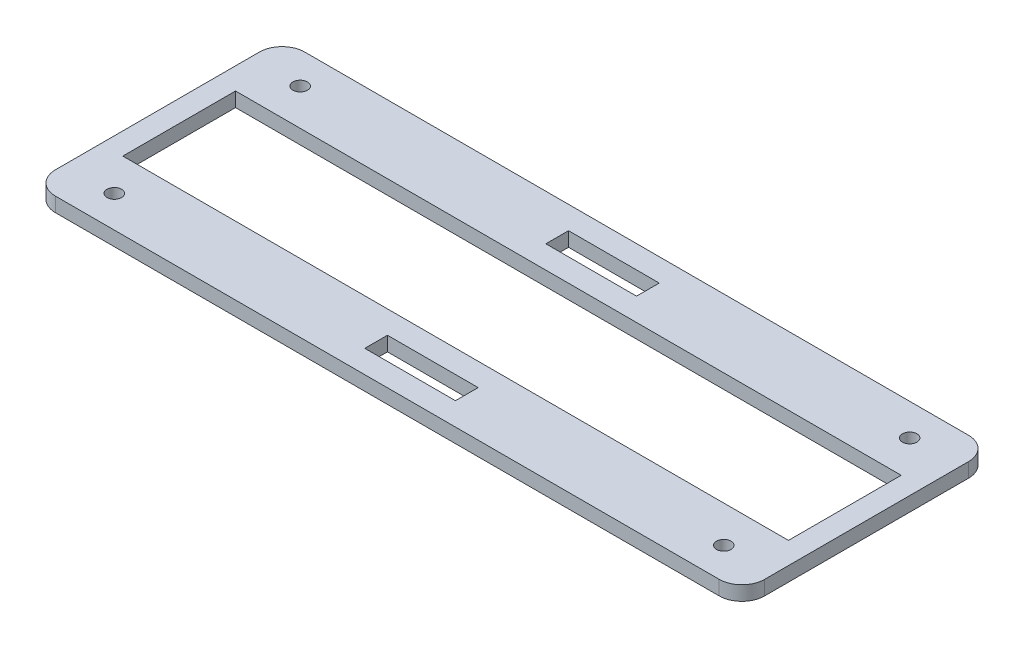
ISO-10303-21;
HEADER;
FILE_DESCRIPTION(('STEP AP214'),'2;1');
FILE_NAME('part.step','',(''),(''),'','','');
FILE_SCHEMA(('AUTOMOTIVE_DESIGN { 1 0 10303 214 1 1 1 1 }'));
ENDSEC;
DATA;
#1=APPLICATION_CONTEXT('core data for automotive mechanical design processes');
#2=APPLICATION_PROTOCOL_DEFINITION('international standard','automotive_design',2000,#1);
#3=PRODUCT_CONTEXT('',#1,'mechanical');
#4=PRODUCT('Part','Part','',(#3));
#5=PRODUCT_RELATED_PRODUCT_CATEGORY('part','',(#4));
#6=PRODUCT_DEFINITION_FORMATION('','',#4);
#7=PRODUCT_DEFINITION_CONTEXT('part definition',#1,'design');
#8=PRODUCT_DEFINITION('design','',#6,#7);
#9=PRODUCT_DEFINITION_SHAPE('','',#8);
#10=(LENGTH_UNIT() NAMED_UNIT(*) SI_UNIT(.MILLI.,.METRE.));
#11=(NAMED_UNIT(*) PLANE_ANGLE_UNIT() SI_UNIT($,.RADIAN.));
#12=(NAMED_UNIT(*) SI_UNIT($,.STERADIAN.) SOLID_ANGLE_UNIT());
#13=UNCERTAINTY_MEASURE_WITH_UNIT(LENGTH_MEASURE(1.E-05),#10,'distance_accuracy_value','');
#14=(GEOMETRIC_REPRESENTATION_CONTEXT(3) GLOBAL_UNCERTAINTY_ASSIGNED_CONTEXT((#13)) GLOBAL_UNIT_ASSIGNED_CONTEXT((#10,
#11,#12)) REPRESENTATION_CONTEXT('',''));
#15=CARTESIAN_POINT('',(0.,0.,0.));
#16=DIRECTION('',(0.,0.,1.));
#17=DIRECTION('',(1.,0.,0.));
#18=AXIS2_PLACEMENT_3D('',#15,#16,#17);
#19=CARTESIAN_POINT('',(78.2,3.175,-27.5));
#20=DIRECTION('',(-1.,0.,0.));
#21=DIRECTION('',(0.,0.,1.));
#22=AXIS2_PLACEMENT_3D('',#19,#20,#21);
#23=PLANE('',#22);
#24=DIRECTION('',(0.,0.,-1.));
#25=VECTOR('',#24,1.);
#26=CARTESIAN_POINT('',(78.2,0.,-27.5));
#27=LINE('',#26,#25);
#28=CARTESIAN_POINT('',(78.2,0.,22.5));
#29=VERTEX_POINT('',#28);
#30=CARTESIAN_POINT('',(78.2,0.,-22.5));
#31=VERTEX_POINT('',#30);
#32=EDGE_CURVE('E301',#29,#31,#27,.T.);
#33=ORIENTED_EDGE('',*,*,#32,.T.);
#34=DIRECTION('',(0.,-1.,0.));
#35=VECTOR('',#34,1.);
#36=CARTESIAN_POINT('',(78.2,3.175,-22.5));
#37=LINE('',#36,#35);
#38=CARTESIAN_POINT('',(78.2,3.175,-22.5));
#39=VERTEX_POINT('',#38);
#40=EDGE_CURVE('E340',#31,#39,#37,.F.);
#41=ORIENTED_EDGE('',*,*,#40,.T.);
#42=DIRECTION('',(0.,0.,-1.));
#43=VECTOR('',#42,1.);
#44=CARTESIAN_POINT('',(78.2,3.175,-27.5));
#45=LINE('',#44,#43);
#46=CARTESIAN_POINT('',(78.2,3.175,22.5));
#47=VERTEX_POINT('',#46);
#48=EDGE_CURVE('E304',#47,#39,#45,.T.);
#49=ORIENTED_EDGE('',*,*,#48,.F.);
#50=DIRECTION('',(0.,-1.,0.));
#51=VECTOR('',#50,1.);
#52=CARTESIAN_POINT('',(78.2,3.175,22.5));
#53=LINE('',#52,#51);
#54=EDGE_CURVE('E337',#47,#29,#53,.T.);
#55=ORIENTED_EDGE('',*,*,#54,.T.);
#56=EDGE_LOOP('',(#33,#41,#49,#55));
#57=FACE_BOUND('',#56,.T.);
#58=ADVANCED_FACE('F33',(#57),#23,.F.);
#59=CARTESIAN_POINT('',(-78.2,3.175,-27.5));
#60=DIRECTION('',(0.,0.,1.));
#61=DIRECTION('',(1.,0.,0.));
#62=AXIS2_PLACEMENT_3D('',#59,#60,#61);
#63=PLANE('',#62);
#64=DIRECTION('',(-1.,0.,0.));
#65=VECTOR('',#64,1.);
#66=CARTESIAN_POINT('',(-78.2,3.175,-27.5));
#67=LINE('',#66,#65);
#68=CARTESIAN_POINT('',(73.2,3.175,-27.5));
#69=VERTEX_POINT('',#68);
#70=CARTESIAN_POINT('',(-73.2,3.175,-27.5));
#71=VERTEX_POINT('',#70);
#72=EDGE_CURVE('E307',#69,#71,#67,.T.);
#73=ORIENTED_EDGE('',*,*,#72,.F.);
#74=DIRECTION('',(0.,-1.,0.));
#75=VECTOR('',#74,1.);
#76=CARTESIAN_POINT('',(73.2,3.175,-27.5));
#77=LINE('',#76,#75);
#78=CARTESIAN_POINT('',(73.2,0.,-27.5));
#79=VERTEX_POINT('',#78);
#80=EDGE_CURVE('E326',#69,#79,#77,.T.);
#81=ORIENTED_EDGE('',*,*,#80,.T.);
#82=DIRECTION('',(-1.,0.,0.));
#83=VECTOR('',#82,1.);
#84=CARTESIAN_POINT('',(-78.2,0.,-27.5));
#85=LINE('',#84,#83);
#86=CARTESIAN_POINT('',(-73.2,0.,-27.5));
#87=VERTEX_POINT('',#86);
#88=EDGE_CURVE('E318',#79,#87,#85,.T.);
#89=ORIENTED_EDGE('',*,*,#88,.T.);
#90=DIRECTION('',(0.,-1.,0.));
#91=VECTOR('',#90,1.);
#92=CARTESIAN_POINT('',(-73.2,3.175,-27.5));
#93=LINE('',#92,#91);
#94=EDGE_CURVE('E315',#87,#71,#93,.F.);
#95=ORIENTED_EDGE('',*,*,#94,.T.);
#96=EDGE_LOOP('',(#73,#81,#89,#95));
#97=FACE_BOUND('',#96,.T.);
#98=ADVANCED_FACE('F380',(#97),#63,.F.);
#99=CARTESIAN_POINT('',(-78.2,3.175,-27.5));
#100=DIRECTION('',(1.,0.,0.));
#101=DIRECTION('',(0.,0.,-1.));
#102=AXIS2_PLACEMENT_3D('',#99,#100,#101);
#103=PLANE('',#102);
#104=DIRECTION('',(0.,0.,1.));
#105=VECTOR('',#104,1.);
#106=CARTESIAN_POINT('',(-78.2,3.175,-27.5));
#107=LINE('',#106,#105);
#108=CARTESIAN_POINT('',(-78.2,3.175,-22.5));
#109=VERTEX_POINT('',#108);
#110=CARTESIAN_POINT('',(-78.2,3.175,22.5));
#111=VERTEX_POINT('',#110);
#112=EDGE_CURVE('E311',#109,#111,#107,.T.);
#113=ORIENTED_EDGE('',*,*,#112,.F.);
#114=DIRECTION('',(0.,-1.,0.));
#115=VECTOR('',#114,1.);
#116=CARTESIAN_POINT('',(-78.2,3.175,-22.5));
#117=LINE('',#116,#115);
#118=CARTESIAN_POINT('',(-78.2,0.,-22.5));
#119=VERTEX_POINT('',#118);
#120=EDGE_CURVE('E11',#109,#119,#117,.T.);
#121=ORIENTED_EDGE('',*,*,#120,.T.);
#122=DIRECTION('',(0.,0.,1.));
#123=VECTOR('',#122,1.);
#124=CARTESIAN_POINT('',(-78.2,0.,-27.5));
#125=LINE('',#124,#123);
#126=CARTESIAN_POINT('',(-78.2,0.,22.5));
#127=VERTEX_POINT('',#126);
#128=EDGE_CURVE('E321',#119,#127,#125,.T.);
#129=ORIENTED_EDGE('',*,*,#128,.T.);
#130=DIRECTION('',(0.,-1.,0.));
#131=VECTOR('',#130,1.);
#132=CARTESIAN_POINT('',(-78.2,3.175,22.5));
#133=LINE('',#132,#131);
#134=EDGE_CURVE('E41',#127,#111,#133,.F.);
#135=ORIENTED_EDGE('',*,*,#134,.T.);
#136=EDGE_LOOP('',(#113,#121,#129,#135));
#137=FACE_BOUND('',#136,.T.);
#138=ADVANCED_FACE('F355',(#137),#103,.F.);
#139=CARTESIAN_POINT('',(-78.2,3.175,27.5));
#140=DIRECTION('',(0.,0.,-1.));
#141=DIRECTION('',(-1.,0.,0.));
#142=AXIS2_PLACEMENT_3D('',#139,#140,#141);
#143=PLANE('',#142);
#144=DIRECTION('',(1.,0.,0.));
#145=VECTOR('',#144,1.);
#146=CARTESIAN_POINT('',(-78.2,0.,27.5));
#147=LINE('',#146,#145);
#148=CARTESIAN_POINT('',(-73.2,0.,27.5));
#149=VERTEX_POINT('',#148);
#150=CARTESIAN_POINT('',(73.2,0.,27.5));
#151=VERTEX_POINT('',#150);
#152=EDGE_CURVE('E308',#149,#151,#147,.T.);
#153=ORIENTED_EDGE('',*,*,#152,.T.);
#154=DIRECTION('',(0.,-1.,0.));
#155=VECTOR('',#154,1.);
#156=CARTESIAN_POINT('',(73.2,3.175,27.5));
#157=LINE('',#156,#155);
#158=CARTESIAN_POINT('',(73.2,3.175,27.5));
#159=VERTEX_POINT('',#158);
#160=EDGE_CURVE('E48',#151,#159,#157,.F.);
#161=ORIENTED_EDGE('',*,*,#160,.T.);
#162=DIRECTION('',(1.,0.,0.));
#163=VECTOR('',#162,1.);
#164=CARTESIAN_POINT('',(-78.2,3.175,27.5));
#165=LINE('',#164,#163);
#166=CARTESIAN_POINT('',(-73.2,3.175,27.5));
#167=VERTEX_POINT('',#166);
#168=EDGE_CURVE('E313',#167,#159,#165,.T.);
#169=ORIENTED_EDGE('',*,*,#168,.F.);
#170=DIRECTION('',(0.,-1.,0.));
#171=VECTOR('',#170,1.);
#172=CARTESIAN_POINT('',(-73.2,3.175,27.5));
#173=LINE('',#172,#171);
#174=EDGE_CURVE('E349',#167,#149,#173,.T.);
#175=ORIENTED_EDGE('',*,*,#174,.T.);
#176=EDGE_LOOP('',(#153,#161,#169,#175));
#177=FACE_BOUND('',#176,.T.);
#178=ADVANCED_FACE('F362',(#177),#143,.F.);
#179=CARTESIAN_POINT('',(0.,3.175,0.));
#180=DIRECTION('',(0.,1.,0.));
#181=DIRECTION('',(0.,0.,1.));
#182=AXIS2_PLACEMENT_3D('',#179,#180,#181);
#183=PLANE('',#182);
#184=DIRECTION('',(-1.,0.,0.));
#185=VECTOR('',#184,1.);
#186=CARTESIAN_POINT('',(-9.99999999999999,3.175,-17.4649999999999));
#187=LINE('',#186,#185);
#188=CARTESIAN_POINT('',(10.,3.175,-17.4649999999999));
#189=VERTEX_POINT('',#188);
#190=CARTESIAN_POINT('',(-9.99999999999999,3.175,-17.4649999999999));
#191=VERTEX_POINT('',#190);
#192=EDGE_CURVE('E176',#189,#191,#187,.T.);
#193=ORIENTED_EDGE('',*,*,#192,.T.);
#194=DIRECTION('',(0.,0.,-1.));
#195=VECTOR('',#194,1.);
#196=CARTESIAN_POINT('',(-9.99999999999999,3.175,-17.4649999999999));
#197=LINE('',#196,#195);
#198=CARTESIAN_POINT('',(-9.99999999999999,3.175,-22.4649999999999));
#199=VERTEX_POINT('',#198);
#200=EDGE_CURVE('E188',#191,#199,#197,.T.);
#201=ORIENTED_EDGE('',*,*,#200,.T.);
#202=DIRECTION('',(1.,0.,0.));
#203=VECTOR('',#202,1.);
#204=CARTESIAN_POINT('',(-9.99999999999999,3.175,-22.4649999999999));
#205=LINE('',#204,#203);
#206=CARTESIAN_POINT('',(10.,3.175,-22.4649999999999));
#207=VERTEX_POINT('',#206);
#208=EDGE_CURVE('E192',#199,#207,#205,.T.);
#209=ORIENTED_EDGE('',*,*,#208,.T.);
#210=DIRECTION('',(0.,0.,1.));
#211=VECTOR('',#210,1.);
#212=CARTESIAN_POINT('',(10.,3.175,-17.4649999999999));
#213=LINE('',#212,#211);
#214=EDGE_CURVE('E184',#207,#189,#213,.T.);
#215=ORIENTED_EDGE('',*,*,#214,.T.);
#216=EDGE_LOOP('',(#193,#201,#209,#215));
#217=FACE_BOUND('',#216,.T.);
#218=DIRECTION('',(0.,0.,1.));
#219=VECTOR('',#218,1.);
#220=CARTESIAN_POINT('',(10.,3.175,17.4649999999999));
#221=LINE('',#220,#219);
#222=CARTESIAN_POINT('',(10.,3.175,17.4649999999999));
#223=VERTEX_POINT('',#222);
#224=CARTESIAN_POINT('',(10.,3.175,22.4649999999999));
#225=VERTEX_POINT('',#224);
#226=EDGE_CURVE('E216',#223,#225,#221,.T.);
#227=ORIENTED_EDGE('',*,*,#226,.T.);
#228=DIRECTION('',(-1.,0.,0.));
#229=VECTOR('',#228,1.);
#230=CARTESIAN_POINT('',(-9.99999999999999,3.175,22.4649999999999));
#231=LINE('',#230,#229);
#232=CARTESIAN_POINT('',(-9.99999999999999,3.175,22.4649999999999));
#233=VERTEX_POINT('',#232);
#234=EDGE_CURVE('E219',#225,#233,#231,.T.);
#235=ORIENTED_EDGE('',*,*,#234,.T.);
#236=DIRECTION('',(0.,0.,-1.));
#237=VECTOR('',#236,1.);
#238=CARTESIAN_POINT('',(-9.99999999999999,3.175,17.4649999999999));
#239=LINE('',#238,#237);
#240=CARTESIAN_POINT('',(-9.99999999999999,3.175,17.4649999999999));
#241=VERTEX_POINT('',#240);
#242=EDGE_CURVE('E223',#233,#241,#239,.T.);
#243=ORIENTED_EDGE('',*,*,#242,.T.);
#244=DIRECTION('',(1.,0.,0.));
#245=VECTOR('',#244,1.);
#246=CARTESIAN_POINT('',(-9.99999999999999,3.175,17.4649999999999));
#247=LINE('',#246,#245);
#248=EDGE_CURVE('E226',#241,#223,#247,.T.);
#249=ORIENTED_EDGE('',*,*,#248,.T.);
#250=EDGE_LOOP('',(#227,#235,#243,#249));
#251=FACE_BOUND('',#250,.T.);
#252=DIRECTION('',(0.,0.,-1.));
#253=VECTOR('',#252,1.);
#254=CARTESIAN_POINT('',(-73.39,3.175,12.4299999999999));
#255=LINE('',#254,#253);
#256=CARTESIAN_POINT('',(-73.39,3.175,12.4299999999999));
#257=VERTEX_POINT('',#256);
#258=CARTESIAN_POINT('',(-73.39,3.175,-12.4300000000001));
#259=VERTEX_POINT('',#258);
#260=EDGE_CURVE('E248',#257,#259,#255,.T.);
#261=ORIENTED_EDGE('',*,*,#260,.T.);
#262=DIRECTION('',(1.,0.,0.));
#263=VECTOR('',#262,1.);
#264=CARTESIAN_POINT('',(-73.39,3.175,-12.4300000000001));
#265=LINE('',#264,#263);
#266=CARTESIAN_POINT('',(73.39,3.175,-12.4300000000001));
#267=VERTEX_POINT('',#266);
#268=EDGE_CURVE('E251',#259,#267,#265,.T.);
#269=ORIENTED_EDGE('',*,*,#268,.T.);
#270=DIRECTION('',(0.,0.,1.));
#271=VECTOR('',#270,1.);
#272=CARTESIAN_POINT('',(73.39,3.175,12.4299999999999));
#273=LINE('',#272,#271);
#274=CARTESIAN_POINT('',(73.39,3.175,12.4299999999999));
#275=VERTEX_POINT('',#274);
#276=EDGE_CURVE('E255',#267,#275,#273,.T.);
#277=ORIENTED_EDGE('',*,*,#276,.T.);
#278=DIRECTION('',(-1.,0.,0.));
#279=VECTOR('',#278,1.);
#280=CARTESIAN_POINT('',(-73.39,3.175,12.4299999999999));
#281=LINE('',#280,#279);
#282=EDGE_CURVE('E258',#275,#257,#281,.T.);
#283=ORIENTED_EDGE('',*,*,#282,.T.);
#284=EDGE_LOOP('',(#261,#269,#277,#283));
#285=FACE_BOUND('',#284,.T.);
#286=CARTESIAN_POINT('',(-67.2,3.175,20.5));
#287=DIRECTION('',(0.,-1.,0.));
#288=DIRECTION('',(0.,0.,-1.));
#289=AXIS2_PLACEMENT_3D('',#286,#287,#288);
#290=CIRCLE('',#289,1.6);
#291=CARTESIAN_POINT('',(-67.2,3.175,18.9));
#292=VERTEX_POINT('',#291);
#293=EDGE_CURVE('E280',#292,#292,#290,.T.);
#294=ORIENTED_EDGE('',*,*,#293,.T.);
#295=EDGE_LOOP('',(#294));
#296=FACE_BOUND('',#295,.T.);
#297=CARTESIAN_POINT('',(-67.2,3.175,-20.5));
#298=DIRECTION('',(0.,-1.,0.));
#299=DIRECTION('',(0.,0.,-1.));
#300=AXIS2_PLACEMENT_3D('',#297,#298,#299);
#301=CIRCLE('',#300,1.6);
#302=CARTESIAN_POINT('',(-67.2,3.175,-22.1));
#303=VERTEX_POINT('',#302);
#304=EDGE_CURVE('E286',#303,#303,#301,.T.);
#305=ORIENTED_EDGE('',*,*,#304,.T.);
#306=EDGE_LOOP('',(#305));
#307=FACE_BOUND('',#306,.T.);
#308=CARTESIAN_POINT('',(67.2,3.175,-20.5));
#309=DIRECTION('',(0.,-1.,0.));
#310=DIRECTION('',(0.,0.,-1.));
#311=AXIS2_PLACEMENT_3D('',#308,#309,#310);
#312=CIRCLE('',#311,1.6);
#313=CARTESIAN_POINT('',(67.2,3.175,-22.1));
#314=VERTEX_POINT('',#313);
#315=EDGE_CURVE('E292',#314,#314,#312,.T.);
#316=ORIENTED_EDGE('',*,*,#315,.T.);
#317=EDGE_LOOP('',(#316));
#318=FACE_BOUND('',#317,.T.);
#319=CARTESIAN_POINT('',(67.2,3.175,20.5));
#320=DIRECTION('',(0.,-1.,0.));
#321=DIRECTION('',(0.,0.,-1.));
#322=AXIS2_PLACEMENT_3D('',#319,#320,#321);
#323=CIRCLE('',#322,1.6);
#324=CARTESIAN_POINT('',(67.2,3.175,18.9));
#325=VERTEX_POINT('',#324);
#326=EDGE_CURVE('E298',#325,#325,#323,.T.);
#327=ORIENTED_EDGE('',*,*,#326,.T.);
#328=EDGE_LOOP('',(#327));
#329=FACE_BOUND('',#328,.T.);
#330=ORIENTED_EDGE('',*,*,#48,.T.);
#331=CARTESIAN_POINT('',(73.2,3.175,-22.5));
#332=DIRECTION('',(0.,1.,0.));
#333=DIRECTION('',(0.,0.,1.));
#334=AXIS2_PLACEMENT_3D('',#331,#332,#333);
#335=CIRCLE('',#334,5.);
#336=EDGE_CURVE('E347',#39,#69,#335,.T.);
#337=ORIENTED_EDGE('',*,*,#336,.T.);
#338=ORIENTED_EDGE('',*,*,#72,.T.);
#339=CARTESIAN_POINT('',(-73.2,3.175,-22.5));
#340=DIRECTION('',(0.,1.,0.));
#341=DIRECTION('',(0.,0.,1.));
#342=AXIS2_PLACEMENT_3D('',#339,#340,#341);
#343=CIRCLE('',#342,5.);
#344=EDGE_CURVE('E343',#71,#109,#343,.T.);
#345=ORIENTED_EDGE('',*,*,#344,.T.);
#346=ORIENTED_EDGE('',*,*,#112,.T.);
#347=CARTESIAN_POINT('',(-73.2,3.175,22.5));
#348=DIRECTION('',(0.,1.,0.));
#349=DIRECTION('',(0.,0.,1.));
#350=AXIS2_PLACEMENT_3D('',#347,#348,#349);
#351=CIRCLE('',#350,5.);
#352=EDGE_CURVE('E55',#111,#167,#351,.T.);
#353=ORIENTED_EDGE('',*,*,#352,.T.);
#354=ORIENTED_EDGE('',*,*,#168,.T.);
#355=CARTESIAN_POINT('',(73.2,3.175,22.5));
#356=DIRECTION('',(0.,1.,0.));
#357=DIRECTION('',(0.,0.,1.));
#358=AXIS2_PLACEMENT_3D('',#355,#356,#357);
#359=CIRCLE('',#358,5.);
#360=EDGE_CURVE('E345',#159,#47,#359,.T.);
#361=ORIENTED_EDGE('',*,*,#360,.T.);
#362=EDGE_LOOP('',(#330,#337,#338,#345,#346,#353,#354,#361));
#363=FACE_BOUND('',#362,.T.);
#364=ADVANCED_FACE('F194',(#217,#251,#285,#296,#307,#318,#329,#363),#183,.T.);
#365=CARTESIAN_POINT('',(0.,0.,0.));
#366=DIRECTION('',(0.,1.,0.));
#367=DIRECTION('',(0.,0.,1.));
#368=AXIS2_PLACEMENT_3D('',#365,#366,#367);
#369=PLANE('',#368);
#370=DIRECTION('',(0.,0.,-1.));
#371=VECTOR('',#370,1.);
#372=CARTESIAN_POINT('',(-9.99999999999999,0.,-17.4649999999999));
#373=LINE('',#372,#371);
#374=CARTESIAN_POINT('',(-9.99999999999999,0.,-17.4649999999999));
#375=VERTEX_POINT('',#374);
#376=CARTESIAN_POINT('',(-9.99999999999999,0.,-22.4649999999999));
#377=VERTEX_POINT('',#376);
#378=EDGE_CURVE('E206',#375,#377,#373,.T.);
#379=ORIENTED_EDGE('',*,*,#378,.F.);
#380=DIRECTION('',(-1.,0.,0.));
#381=VECTOR('',#380,1.);
#382=CARTESIAN_POINT('',(-9.99999999999999,0.,-17.4649999999999));
#383=LINE('',#382,#381);
#384=CARTESIAN_POINT('',(10.,0.,-17.4649999999999));
#385=VERTEX_POINT('',#384);
#386=EDGE_CURVE('E179',#385,#375,#383,.T.);
#387=ORIENTED_EDGE('',*,*,#386,.F.);
#388=DIRECTION('',(0.,0.,1.));
#389=VECTOR('',#388,1.);
#390=CARTESIAN_POINT('',(10.,0.,-17.4649999999999));
#391=LINE('',#390,#389);
#392=CARTESIAN_POINT('',(10.,0.,-22.4649999999999));
#393=VERTEX_POINT('',#392);
#394=EDGE_CURVE('E197',#393,#385,#391,.T.);
#395=ORIENTED_EDGE('',*,*,#394,.F.);
#396=DIRECTION('',(1.,0.,0.));
#397=VECTOR('',#396,1.);
#398=CARTESIAN_POINT('',(-9.99999999999999,0.,-22.4649999999999));
#399=LINE('',#398,#397);
#400=EDGE_CURVE('E200',#377,#393,#399,.T.);
#401=ORIENTED_EDGE('',*,*,#400,.F.);
#402=EDGE_LOOP('',(#379,#387,#395,#401));
#403=FACE_BOUND('',#402,.T.);
#404=DIRECTION('',(-1.,0.,0.));
#405=VECTOR('',#404,1.);
#406=CARTESIAN_POINT('',(-9.99999999999999,0.,22.4649999999999));
#407=LINE('',#406,#405);
#408=CARTESIAN_POINT('',(10.,0.,22.4649999999999));
#409=VERTEX_POINT('',#408);
#410=CARTESIAN_POINT('',(-9.99999999999999,0.,22.4649999999999));
#411=VERTEX_POINT('',#410);
#412=EDGE_CURVE('E231',#409,#411,#407,.T.);
#413=ORIENTED_EDGE('',*,*,#412,.F.);
#414=DIRECTION('',(0.,0.,1.));
#415=VECTOR('',#414,1.);
#416=CARTESIAN_POINT('',(10.,0.,17.4649999999999));
#417=LINE('',#416,#415);
#418=CARTESIAN_POINT('',(10.,0.,17.4649999999999));
#419=VERTEX_POINT('',#418);
#420=EDGE_CURVE('E212',#419,#409,#417,.T.);
#421=ORIENTED_EDGE('',*,*,#420,.F.);
#422=DIRECTION('',(1.,0.,0.));
#423=VECTOR('',#422,1.);
#424=CARTESIAN_POINT('',(-9.99999999999999,0.,17.4649999999999));
#425=LINE('',#424,#423);
#426=CARTESIAN_POINT('',(-9.99999999999999,0.,17.4649999999999));
#427=VERTEX_POINT('',#426);
#428=EDGE_CURVE('E220',#427,#419,#425,.T.);
#429=ORIENTED_EDGE('',*,*,#428,.F.);
#430=DIRECTION('',(0.,0.,-1.));
#431=VECTOR('',#430,1.);
#432=CARTESIAN_POINT('',(-9.99999999999999,0.,17.4649999999999));
#433=LINE('',#432,#431);
#434=EDGE_CURVE('E234',#411,#427,#433,.T.);
#435=ORIENTED_EDGE('',*,*,#434,.F.);
#436=EDGE_LOOP('',(#413,#421,#429,#435));
#437=FACE_BOUND('',#436,.T.);
#438=DIRECTION('',(1.,0.,0.));
#439=VECTOR('',#438,1.);
#440=CARTESIAN_POINT('',(-73.39,0.,-12.4300000000001));
#441=LINE('',#440,#439);
#442=CARTESIAN_POINT('',(-73.39,0.,-12.4300000000001));
#443=VERTEX_POINT('',#442);
#444=CARTESIAN_POINT('',(73.39,0.,-12.4300000000001));
#445=VERTEX_POINT('',#444);
#446=EDGE_CURVE('E263',#443,#445,#441,.T.);
#447=ORIENTED_EDGE('',*,*,#446,.F.);
#448=DIRECTION('',(0.,0.,-1.));
#449=VECTOR('',#448,1.);
#450=CARTESIAN_POINT('',(-73.39,0.,12.4299999999999));
#451=LINE('',#450,#449);
#452=CARTESIAN_POINT('',(-73.39,0.,12.4299999999999));
#453=VERTEX_POINT('',#452);
#454=EDGE_CURVE('E241',#453,#443,#451,.T.);
#455=ORIENTED_EDGE('',*,*,#454,.F.);
#456=DIRECTION('',(-1.,0.,0.));
#457=VECTOR('',#456,1.);
#458=CARTESIAN_POINT('',(-73.39,0.,12.4299999999999));
#459=LINE('',#458,#457);
#460=CARTESIAN_POINT('',(73.39,0.,12.4299999999999));
#461=VERTEX_POINT('',#460);
#462=EDGE_CURVE('E252',#461,#453,#459,.T.);
#463=ORIENTED_EDGE('',*,*,#462,.F.);
#464=DIRECTION('',(0.,0.,1.));
#465=VECTOR('',#464,1.);
#466=CARTESIAN_POINT('',(73.39,0.,12.4299999999999));
#467=LINE('',#466,#465);
#468=EDGE_CURVE('E266',#445,#461,#467,.T.);
#469=ORIENTED_EDGE('',*,*,#468,.F.);
#470=EDGE_LOOP('',(#447,#455,#463,#469));
#471=FACE_BOUND('',#470,.T.);
#472=CARTESIAN_POINT('',(-67.2,0.,20.5));
#473=DIRECTION('',(0.,-1.,0.));
#474=DIRECTION('',(0.,0.,-1.));
#475=AXIS2_PLACEMENT_3D('',#472,#473,#474);
#476=CIRCLE('',#475,1.6);
#477=CARTESIAN_POINT('',(-67.2,0.,18.9));
#478=VERTEX_POINT('',#477);
#479=EDGE_CURVE('E273',#478,#478,#476,.T.);
#480=ORIENTED_EDGE('',*,*,#479,.F.);
#481=EDGE_LOOP('',(#480));
#482=FACE_BOUND('',#481,.T.);
#483=CARTESIAN_POINT('',(-67.2,0.,-20.5));
#484=DIRECTION('',(0.,-1.,0.));
#485=DIRECTION('',(0.,0.,-1.));
#486=AXIS2_PLACEMENT_3D('',#483,#484,#485);
#487=CIRCLE('',#486,1.6);
#488=CARTESIAN_POINT('',(-67.2,0.,-22.1));
#489=VERTEX_POINT('',#488);
#490=EDGE_CURVE('E283',#489,#489,#487,.T.);
#491=ORIENTED_EDGE('',*,*,#490,.F.);
#492=EDGE_LOOP('',(#491));
#493=FACE_BOUND('',#492,.T.);
#494=CARTESIAN_POINT('',(67.2,0.,-20.5));
#495=DIRECTION('',(0.,-1.,0.));
#496=DIRECTION('',(0.,0.,-1.));
#497=AXIS2_PLACEMENT_3D('',#494,#495,#496);
#498=CIRCLE('',#497,1.6);
#499=CARTESIAN_POINT('',(67.2,0.,-22.1));
#500=VERTEX_POINT('',#499);
#501=EDGE_CURVE('E289',#500,#500,#498,.T.);
#502=ORIENTED_EDGE('',*,*,#501,.F.);
#503=EDGE_LOOP('',(#502));
#504=FACE_BOUND('',#503,.T.);
#505=CARTESIAN_POINT('',(67.2,0.,20.5));
#506=DIRECTION('',(0.,-1.,0.));
#507=DIRECTION('',(0.,0.,-1.));
#508=AXIS2_PLACEMENT_3D('',#505,#506,#507);
#509=CIRCLE('',#508,1.6);
#510=CARTESIAN_POINT('',(67.2,0.,18.9));
#511=VERTEX_POINT('',#510);
#512=EDGE_CURVE('E295',#511,#511,#509,.T.);
#513=ORIENTED_EDGE('',*,*,#512,.F.);
#514=EDGE_LOOP('',(#513));
#515=FACE_BOUND('',#514,.T.);
#516=ORIENTED_EDGE('',*,*,#88,.F.);
#517=CARTESIAN_POINT('',(73.2,0.,-22.5));
#518=DIRECTION('',(0.,1.,0.));
#519=DIRECTION('',(0.,0.,1.));
#520=AXIS2_PLACEMENT_3D('',#517,#518,#519);
#521=CIRCLE('',#520,5.);
#522=EDGE_CURVE('E335',#79,#31,#521,.F.);
#523=ORIENTED_EDGE('',*,*,#522,.T.);
#524=ORIENTED_EDGE('',*,*,#32,.F.);
#525=CARTESIAN_POINT('',(73.2,0.,22.5));
#526=DIRECTION('',(0.,1.,0.));
#527=DIRECTION('',(0.,0.,1.));
#528=AXIS2_PLACEMENT_3D('',#525,#526,#527);
#529=CIRCLE('',#528,5.);
#530=EDGE_CURVE('E333',#29,#151,#529,.F.);
#531=ORIENTED_EDGE('',*,*,#530,.T.);
#532=ORIENTED_EDGE('',*,*,#152,.F.);
#533=CARTESIAN_POINT('',(-73.2,0.,22.5));
#534=DIRECTION('',(0.,1.,0.));
#535=DIRECTION('',(0.,0.,1.));
#536=AXIS2_PLACEMENT_3D('',#533,#534,#535);
#537=CIRCLE('',#536,5.);
#538=EDGE_CURVE('E329',#149,#127,#537,.F.);
#539=ORIENTED_EDGE('',*,*,#538,.T.);
#540=ORIENTED_EDGE('',*,*,#128,.F.);
#541=CARTESIAN_POINT('',(-73.2,0.,-22.5));
#542=DIRECTION('',(0.,1.,0.));
#543=DIRECTION('',(0.,0.,1.));
#544=AXIS2_PLACEMENT_3D('',#541,#542,#543);
#545=CIRCLE('',#544,5.);
#546=EDGE_CURVE('E331',#119,#87,#545,.F.);
#547=ORIENTED_EDGE('',*,*,#546,.T.);
#548=EDGE_LOOP('',(#516,#523,#524,#531,#532,#539,#540,#547));
#549=FACE_BOUND('',#548,.T.);
#550=ADVANCED_FACE('F365',(#403,#437,#471,#482,#493,#504,#515,#549),#369,.F.);
#551=CARTESIAN_POINT('',(67.2,3.175,20.5));
#552=DIRECTION('',(0.,-1.,0.));
#553=DIRECTION('',(0.,0.,-1.));
#554=AXIS2_PLACEMENT_3D('',#551,#552,#553);
#555=CYLINDRICAL_SURFACE('',#554,1.6);
#556=ORIENTED_EDGE('',*,*,#326,.F.);
#557=EDGE_LOOP('',(#556));
#558=FACE_BOUND('',#557,.T.);
#559=ORIENTED_EDGE('',*,*,#512,.T.);
#560=EDGE_LOOP('',(#559));
#561=FACE_BOUND('',#560,.T.);
#562=ADVANCED_FACE('F457',(#558,#561),#555,.F.);
#563=CARTESIAN_POINT('',(67.2,3.175,-20.5));
#564=DIRECTION('',(0.,-1.,0.));
#565=DIRECTION('',(0.,0.,-1.));
#566=AXIS2_PLACEMENT_3D('',#563,#564,#565);
#567=CYLINDRICAL_SURFACE('',#566,1.6);
#568=ORIENTED_EDGE('',*,*,#315,.F.);
#569=EDGE_LOOP('',(#568));
#570=FACE_BOUND('',#569,.T.);
#571=ORIENTED_EDGE('',*,*,#501,.T.);
#572=EDGE_LOOP('',(#571));
#573=FACE_BOUND('',#572,.T.);
#574=ADVANCED_FACE('F453',(#570,#573),#567,.F.);
#575=CARTESIAN_POINT('',(-67.2,3.175,-20.5));
#576=DIRECTION('',(0.,-1.,0.));
#577=DIRECTION('',(0.,0.,-1.));
#578=AXIS2_PLACEMENT_3D('',#575,#576,#577);
#579=CYLINDRICAL_SURFACE('',#578,1.6);
#580=ORIENTED_EDGE('',*,*,#304,.F.);
#581=EDGE_LOOP('',(#580));
#582=FACE_BOUND('',#581,.T.);
#583=ORIENTED_EDGE('',*,*,#490,.T.);
#584=EDGE_LOOP('',(#583));
#585=FACE_BOUND('',#584,.T.);
#586=ADVANCED_FACE('F449',(#582,#585),#579,.F.);
#587=CARTESIAN_POINT('',(-67.2,3.175,20.5));
#588=DIRECTION('',(0.,-1.,0.));
#589=DIRECTION('',(0.,0.,-1.));
#590=AXIS2_PLACEMENT_3D('',#587,#588,#589);
#591=CYLINDRICAL_SURFACE('',#590,1.6);
#592=ORIENTED_EDGE('',*,*,#293,.F.);
#593=EDGE_LOOP('',(#592));
#594=FACE_BOUND('',#593,.T.);
#595=ORIENTED_EDGE('',*,*,#479,.T.);
#596=EDGE_LOOP('',(#595));
#597=FACE_BOUND('',#596,.T.);
#598=ADVANCED_FACE('F445',(#594,#597),#591,.F.);
#599=CARTESIAN_POINT('',(-73.39,3.175,12.4299999999999));
#600=DIRECTION('',(-1.,0.,0.));
#601=DIRECTION('',(0.,0.,1.));
#602=AXIS2_PLACEMENT_3D('',#599,#600,#601);
#603=PLANE('',#602);
#604=ORIENTED_EDGE('',*,*,#454,.T.);
#605=DIRECTION('',(0.,-1.,0.));
#606=VECTOR('',#605,1.);
#607=CARTESIAN_POINT('',(-73.39,3.175,-12.4300000000001));
#608=LINE('',#607,#606);
#609=EDGE_CURVE('E261',#259,#443,#608,.T.);
#610=ORIENTED_EDGE('',*,*,#609,.F.);
#611=ORIENTED_EDGE('',*,*,#260,.F.);
#612=DIRECTION('',(0.,-1.,0.));
#613=VECTOR('',#612,1.);
#614=CARTESIAN_POINT('',(-73.39,3.175,12.4299999999999));
#615=LINE('',#614,#613);
#616=EDGE_CURVE('E271',#257,#453,#615,.T.);
#617=ORIENTED_EDGE('',*,*,#616,.T.);
#618=EDGE_LOOP('',(#604,#610,#611,#617));
#619=FACE_BOUND('',#618,.T.);
#620=ADVANCED_FACE('F435',(#619),#603,.F.);
#621=CARTESIAN_POINT('',(-73.39,3.175,12.4299999999999));
#622=DIRECTION('',(0.,0.,1.));
#623=DIRECTION('',(1.,0.,0.));
#624=AXIS2_PLACEMENT_3D('',#621,#622,#623);
#625=PLANE('',#624);
#626=ORIENTED_EDGE('',*,*,#462,.T.);
#627=ORIENTED_EDGE('',*,*,#616,.F.);
#628=ORIENTED_EDGE('',*,*,#282,.F.);
#629=DIRECTION('',(0.,-1.,0.));
#630=VECTOR('',#629,1.);
#631=CARTESIAN_POINT('',(73.39,3.175,12.4299999999999));
#632=LINE('',#631,#630);
#633=EDGE_CURVE('E274',#275,#461,#632,.T.);
#634=ORIENTED_EDGE('',*,*,#633,.T.);
#635=EDGE_LOOP('',(#626,#627,#628,#634));
#636=FACE_BOUND('',#635,.T.);
#637=ADVANCED_FACE('F431',(#636),#625,.F.);
#638=CARTESIAN_POINT('',(73.39,3.175,12.4299999999999));
#639=DIRECTION('',(1.,0.,0.));
#640=DIRECTION('',(0.,0.,-1.));
#641=AXIS2_PLACEMENT_3D('',#638,#639,#640);
#642=PLANE('',#641);
#643=ORIENTED_EDGE('',*,*,#468,.T.);
#644=ORIENTED_EDGE('',*,*,#633,.F.);
#645=ORIENTED_EDGE('',*,*,#276,.F.);
#646=DIRECTION('',(0.,-1.,0.));
#647=VECTOR('',#646,1.);
#648=CARTESIAN_POINT('',(73.39,3.175,-12.4300000000001));
#649=LINE('',#648,#647);
#650=EDGE_CURVE('E276',#267,#445,#649,.T.);
#651=ORIENTED_EDGE('',*,*,#650,.T.);
#652=EDGE_LOOP('',(#643,#644,#645,#651));
#653=FACE_BOUND('',#652,.T.);
#654=ADVANCED_FACE('F434',(#653),#642,.F.);
#655=CARTESIAN_POINT('',(-73.39,3.175,-12.4300000000001));
#656=DIRECTION('',(0.,0.,-1.));
#657=DIRECTION('',(-1.,0.,0.));
#658=AXIS2_PLACEMENT_3D('',#655,#656,#657);
#659=PLANE('',#658);
#660=ORIENTED_EDGE('',*,*,#446,.T.);
#661=ORIENTED_EDGE('',*,*,#650,.F.);
#662=ORIENTED_EDGE('',*,*,#268,.F.);
#663=ORIENTED_EDGE('',*,*,#609,.T.);
#664=EDGE_LOOP('',(#660,#661,#662,#663));
#665=FACE_BOUND('',#664,.T.);
#666=ADVANCED_FACE('F429',(#665),#659,.F.);
#667=CARTESIAN_POINT('',(10.,3.175,17.4649999999999));
#668=DIRECTION('',(1.,0.,0.));
#669=DIRECTION('',(0.,0.,-1.));
#670=AXIS2_PLACEMENT_3D('',#667,#668,#669);
#671=PLANE('',#670);
#672=ORIENTED_EDGE('',*,*,#420,.T.);
#673=DIRECTION('',(0.,-1.,0.));
#674=VECTOR('',#673,1.);
#675=CARTESIAN_POINT('',(10.,3.175,22.4649999999999));
#676=LINE('',#675,#674);
#677=EDGE_CURVE('E229',#225,#409,#676,.T.);
#678=ORIENTED_EDGE('',*,*,#677,.F.);
#679=ORIENTED_EDGE('',*,*,#226,.F.);
#680=DIRECTION('',(0.,-1.,0.));
#681=VECTOR('',#680,1.);
#682=CARTESIAN_POINT('',(10.,3.175,17.4649999999999));
#683=LINE('',#682,#681);
#684=EDGE_CURVE('E239',#223,#419,#683,.T.);
#685=ORIENTED_EDGE('',*,*,#684,.T.);
#686=EDGE_LOOP('',(#672,#678,#679,#685));
#687=FACE_BOUND('',#686,.T.);
#688=ADVANCED_FACE('F419',(#687),#671,.F.);
#689=CARTESIAN_POINT('',(-9.99999999999999,3.175,17.4649999999999));
#690=DIRECTION('',(0.,0.,-1.));
#691=DIRECTION('',(-1.,0.,0.));
#692=AXIS2_PLACEMENT_3D('',#689,#690,#691);
#693=PLANE('',#692);
#694=ORIENTED_EDGE('',*,*,#428,.T.);
#695=ORIENTED_EDGE('',*,*,#684,.F.);
#696=ORIENTED_EDGE('',*,*,#248,.F.);
#697=DIRECTION('',(0.,-1.,0.));
#698=VECTOR('',#697,1.);
#699=CARTESIAN_POINT('',(-9.99999999999999,3.175,17.4649999999999));
#700=LINE('',#699,#698);
#701=EDGE_CURVE('E242',#241,#427,#700,.T.);
#702=ORIENTED_EDGE('',*,*,#701,.T.);
#703=EDGE_LOOP('',(#694,#695,#696,#702));
#704=FACE_BOUND('',#703,.T.);
#705=ADVANCED_FACE('F415',(#704),#693,.F.);
#706=CARTESIAN_POINT('',(-9.99999999999999,3.175,17.4649999999999));
#707=DIRECTION('',(-1.,0.,0.));
#708=DIRECTION('',(0.,0.,1.));
#709=AXIS2_PLACEMENT_3D('',#706,#707,#708);
#710=PLANE('',#709);
#711=ORIENTED_EDGE('',*,*,#434,.T.);
#712=ORIENTED_EDGE('',*,*,#701,.F.);
#713=ORIENTED_EDGE('',*,*,#242,.F.);
#714=DIRECTION('',(0.,-1.,0.));
#715=VECTOR('',#714,1.);
#716=CARTESIAN_POINT('',(-9.99999999999999,3.175,22.4649999999999));
#717=LINE('',#716,#715);
#718=EDGE_CURVE('E244',#233,#411,#717,.T.);
#719=ORIENTED_EDGE('',*,*,#718,.T.);
#720=EDGE_LOOP('',(#711,#712,#713,#719));
#721=FACE_BOUND('',#720,.T.);
#722=ADVANCED_FACE('F418',(#721),#710,.F.);
#723=CARTESIAN_POINT('',(-9.99999999999999,3.175,22.4649999999999));
#724=DIRECTION('',(0.,0.,1.));
#725=DIRECTION('',(1.,0.,0.));
#726=AXIS2_PLACEMENT_3D('',#723,#724,#725);
#727=PLANE('',#726);
#728=ORIENTED_EDGE('',*,*,#412,.T.);
#729=ORIENTED_EDGE('',*,*,#718,.F.);
#730=ORIENTED_EDGE('',*,*,#234,.F.);
#731=ORIENTED_EDGE('',*,*,#677,.T.);
#732=EDGE_LOOP('',(#728,#729,#730,#731));
#733=FACE_BOUND('',#732,.T.);
#734=ADVANCED_FACE('F414',(#733),#727,.F.);
#735=CARTESIAN_POINT('',(-9.99999999999999,3.175,-17.4649999999999));
#736=DIRECTION('',(0.,0.,1.));
#737=DIRECTION('',(1.,0.,0.));
#738=AXIS2_PLACEMENT_3D('',#735,#736,#737);
#739=PLANE('',#738);
#740=ORIENTED_EDGE('',*,*,#386,.T.);
#741=DIRECTION('',(0.,-1.,0.));
#742=VECTOR('',#741,1.);
#743=CARTESIAN_POINT('',(-9.99999999999999,3.175,-17.4649999999999));
#744=LINE('',#743,#742);
#745=EDGE_CURVE('E172',#191,#375,#744,.T.);
#746=ORIENTED_EDGE('',*,*,#745,.F.);
#747=ORIENTED_EDGE('',*,*,#192,.F.);
#748=DIRECTION('',(0.,-1.,0.));
#749=VECTOR('',#748,1.);
#750=CARTESIAN_POINT('',(10.,3.175,-17.4649999999999));
#751=LINE('',#750,#749);
#752=EDGE_CURVE('E210',#189,#385,#751,.T.);
#753=ORIENTED_EDGE('',*,*,#752,.T.);
#754=EDGE_LOOP('',(#740,#746,#747,#753));
#755=FACE_BOUND('',#754,.T.);
#756=ADVANCED_FACE('F174',(#755),#739,.F.);
#757=CARTESIAN_POINT('',(10.,3.175,-17.4649999999999));
#758=DIRECTION('',(1.,0.,0.));
#759=DIRECTION('',(0.,0.,-1.));
#760=AXIS2_PLACEMENT_3D('',#757,#758,#759);
#761=PLANE('',#760);
#762=ORIENTED_EDGE('',*,*,#394,.T.);
#763=ORIENTED_EDGE('',*,*,#752,.F.);
#764=ORIENTED_EDGE('',*,*,#214,.F.);
#765=DIRECTION('',(0.,-1.,0.));
#766=VECTOR('',#765,1.);
#767=CARTESIAN_POINT('',(10.,3.175,-22.4649999999999));
#768=LINE('',#767,#766);
#769=EDGE_CURVE('E213',#207,#393,#768,.T.);
#770=ORIENTED_EDGE('',*,*,#769,.T.);
#771=EDGE_LOOP('',(#762,#763,#764,#770));
#772=FACE_BOUND('',#771,.T.);
#773=ADVANCED_FACE('F407',(#772),#761,.F.);
#774=CARTESIAN_POINT('',(-9.99999999999999,3.175,-22.4649999999999));
#775=DIRECTION('',(0.,0.,-1.));
#776=DIRECTION('',(-1.,0.,0.));
#777=AXIS2_PLACEMENT_3D('',#774,#775,#776);
#778=PLANE('',#777);
#779=ORIENTED_EDGE('',*,*,#400,.T.);
#780=ORIENTED_EDGE('',*,*,#769,.F.);
#781=ORIENTED_EDGE('',*,*,#208,.F.);
#782=DIRECTION('',(0.,-1.,0.));
#783=VECTOR('',#782,1.);
#784=CARTESIAN_POINT('',(-9.99999999999999,3.175,-22.4649999999999));
#785=LINE('',#784,#783);
#786=EDGE_CURVE('E183',#199,#377,#785,.T.);
#787=ORIENTED_EDGE('',*,*,#786,.T.);
#788=EDGE_LOOP('',(#779,#780,#781,#787));
#789=FACE_BOUND('',#788,.T.);
#790=ADVANCED_FACE('F403',(#789),#778,.F.);
#791=CARTESIAN_POINT('',(-9.99999999999999,3.175,-17.4649999999999));
#792=DIRECTION('',(-1.,0.,0.));
#793=DIRECTION('',(0.,0.,1.));
#794=AXIS2_PLACEMENT_3D('',#791,#792,#793);
#795=PLANE('',#794);
#796=ORIENTED_EDGE('',*,*,#378,.T.);
#797=ORIENTED_EDGE('',*,*,#786,.F.);
#798=ORIENTED_EDGE('',*,*,#200,.F.);
#799=ORIENTED_EDGE('',*,*,#745,.T.);
#800=EDGE_LOOP('',(#796,#797,#798,#799));
#801=FACE_BOUND('',#800,.T.);
#802=ADVANCED_FACE('F189',(#801),#795,.F.);
#803=CARTESIAN_POINT('',(73.2,3.175,-22.5));
#804=DIRECTION('',(0.,-1.,0.));
#805=DIRECTION('',(0.,0.,-1.));
#806=AXIS2_PLACEMENT_3D('',#803,#804,#805);
#807=CYLINDRICAL_SURFACE('',#806,5.);
#808=ORIENTED_EDGE('',*,*,#336,.F.);
#809=ORIENTED_EDGE('',*,*,#40,.F.);
#810=ORIENTED_EDGE('',*,*,#522,.F.);
#811=ORIENTED_EDGE('',*,*,#80,.F.);
#812=EDGE_LOOP('',(#808,#809,#810,#811));
#813=FACE_BOUND('',#812,.T.);
#814=ADVANCED_FACE('F378',(#813),#807,.T.);
#815=CARTESIAN_POINT('',(73.2,3.175,22.5));
#816=DIRECTION('',(0.,-1.,0.));
#817=DIRECTION('',(0.,0.,-1.));
#818=AXIS2_PLACEMENT_3D('',#815,#816,#817);
#819=CYLINDRICAL_SURFACE('',#818,5.);
#820=ORIENTED_EDGE('',*,*,#360,.F.);
#821=ORIENTED_EDGE('',*,*,#160,.F.);
#822=ORIENTED_EDGE('',*,*,#530,.F.);
#823=ORIENTED_EDGE('',*,*,#54,.F.);
#824=EDGE_LOOP('',(#820,#821,#822,#823));
#825=FACE_BOUND('',#824,.T.);
#826=ADVANCED_FACE('F370',(#825),#819,.T.);
#827=CARTESIAN_POINT('',(-73.2,3.175,-22.5));
#828=DIRECTION('',(0.,-1.,0.));
#829=DIRECTION('',(0.,0.,-1.));
#830=AXIS2_PLACEMENT_3D('',#827,#828,#829);
#831=CYLINDRICAL_SURFACE('',#830,5.);
#832=ORIENTED_EDGE('',*,*,#344,.F.);
#833=ORIENTED_EDGE('',*,*,#94,.F.);
#834=ORIENTED_EDGE('',*,*,#546,.F.);
#835=ORIENTED_EDGE('',*,*,#120,.F.);
#836=EDGE_LOOP('',(#832,#833,#834,#835));
#837=FACE_BOUND('',#836,.T.);
#838=ADVANCED_FACE('F383',(#837),#831,.T.);
#839=CARTESIAN_POINT('',(-73.2,3.175,22.5));
#840=DIRECTION('',(0.,-1.,0.));
#841=DIRECTION('',(0.,0.,-1.));
#842=AXIS2_PLACEMENT_3D('',#839,#840,#841);
#843=CYLINDRICAL_SURFACE('',#842,5.);
#844=ORIENTED_EDGE('',*,*,#352,.F.);
#845=ORIENTED_EDGE('',*,*,#134,.F.);
#846=ORIENTED_EDGE('',*,*,#538,.F.);
#847=ORIENTED_EDGE('',*,*,#174,.F.);
#848=EDGE_LOOP('',(#844,#845,#846,#847));
#849=FACE_BOUND('',#848,.T.);
#850=ADVANCED_FACE('F35',(#849),#843,.T.);
#851=CLOSED_SHELL('',(#58,#98,#138,#178,#364,#550,#562,#574,#586,#598,#620,#637,#654,#666,#688,
#705,#722,#734,#756,#773,#790,#802,#814,#826,#838,#850));
#852=MANIFOLD_SOLID_BREP('B2',#851);
#853=ADVANCED_BREP_SHAPE_REPRESENTATION('',(#18,#852),#14);
#854=SHAPE_DEFINITION_REPRESENTATION(#9,#853);
ENDSEC;
END-ISO-10303-21;
